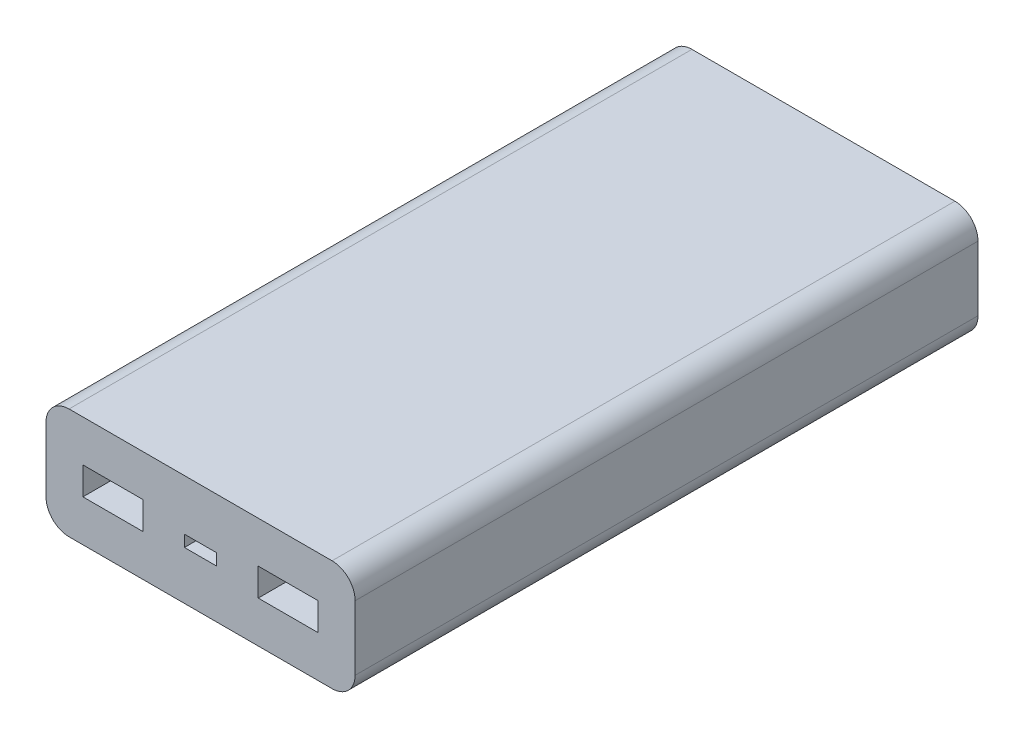
ISO-10303-21;
HEADER;
FILE_DESCRIPTION(('STEP AP214'),'2;1');
FILE_NAME('part.step','',(''),(''),'','','');
FILE_SCHEMA(('AUTOMOTIVE_DESIGN { 1 0 10303 214 1 1 1 1 }'));
ENDSEC;
DATA;
#1=APPLICATION_CONTEXT('core data for automotive mechanical design processes');
#2=APPLICATION_PROTOCOL_DEFINITION('international standard','automotive_design',2000,#1);
#3=PRODUCT_CONTEXT('',#1,'mechanical');
#4=PRODUCT('Part','Part','',(#3));
#5=PRODUCT_RELATED_PRODUCT_CATEGORY('part','',(#4));
#6=PRODUCT_DEFINITION_FORMATION('','',#4);
#7=PRODUCT_DEFINITION_CONTEXT('part definition',#1,'design');
#8=PRODUCT_DEFINITION('design','',#6,#7);
#9=PRODUCT_DEFINITION_SHAPE('','',#8);
#10=(LENGTH_UNIT() NAMED_UNIT(*) SI_UNIT(.MILLI.,.METRE.));
#11=(NAMED_UNIT(*) PLANE_ANGLE_UNIT() SI_UNIT($,.RADIAN.));
#12=(NAMED_UNIT(*) SI_UNIT($,.STERADIAN.) SOLID_ANGLE_UNIT());
#13=UNCERTAINTY_MEASURE_WITH_UNIT(LENGTH_MEASURE(1.E-05),#10,'distance_accuracy_value','');
#14=(GEOMETRIC_REPRESENTATION_CONTEXT(3) GLOBAL_UNCERTAINTY_ASSIGNED_CONTEXT((#13)) GLOBAL_UNIT_ASSIGNED_CONTEXT((#10,
#11,#12)) REPRESENTATION_CONTEXT('',''));
#15=CARTESIAN_POINT('',(0.,0.,0.));
#16=DIRECTION('',(0.,0.,1.));
#17=DIRECTION('',(1.,0.,0.));
#18=AXIS2_PLACEMENT_3D('',#15,#16,#17);
#19=CARTESIAN_POINT('',(0.,0.,135.));
#20=DIRECTION('',(1.,0.,0.));
#21=DIRECTION('',(0.,0.,-1.));
#22=AXIS2_PLACEMENT_3D('',#19,#20,#21);
#23=PLANE('',#22);
#24=DIRECTION('',(0.,-1.,0.));
#25=VECTOR('',#24,1.);
#26=CARTESIAN_POINT('',(0.,0.,0.));
#27=LINE('',#26,#25);
#28=CARTESIAN_POINT('',(0.,19.,0.));
#29=VERTEX_POINT('',#28);
#30=CARTESIAN_POINT('',(0.,5.,0.));
#31=VERTEX_POINT('',#30);
#32=EDGE_CURVE('E206',#29,#31,#27,.T.);
#33=ORIENTED_EDGE('',*,*,#32,.T.);
#34=DIRECTION('',(0.,0.,-1.));
#35=VECTOR('',#34,1.);
#36=CARTESIAN_POINT('',(0.,5.,135.));
#37=LINE('',#36,#35);
#38=CARTESIAN_POINT('',(0.,5.,135.));
#39=VERTEX_POINT('',#38);
#40=EDGE_CURVE('E310',#31,#39,#37,.F.);
#41=ORIENTED_EDGE('',*,*,#40,.T.);
#42=DIRECTION('',(0.,-1.,0.));
#43=VECTOR('',#42,1.);
#44=CARTESIAN_POINT('',(0.,0.,135.));
#45=LINE('',#44,#43);
#46=CARTESIAN_POINT('',(0.,19.,135.));
#47=VERTEX_POINT('',#46);
#48=EDGE_CURVE('E271',#47,#39,#45,.T.);
#49=ORIENTED_EDGE('',*,*,#48,.F.);
#50=DIRECTION('',(0.,0.,-1.));
#51=VECTOR('',#50,1.);
#52=CARTESIAN_POINT('',(0.,19.,135.));
#53=LINE('',#52,#51);
#54=EDGE_CURVE('E307',#47,#29,#53,.T.);
#55=ORIENTED_EDGE('',*,*,#54,.T.);
#56=EDGE_LOOP('',(#33,#41,#49,#55));
#57=FACE_BOUND('',#56,.T.);
#58=ADVANCED_FACE('F33',(#57),#23,.F.);
#59=CARTESIAN_POINT('',(0.,0.,135.));
#60=DIRECTION('',(0.,1.,0.));
#61=DIRECTION('',(0.,0.,1.));
#62=AXIS2_PLACEMENT_3D('',#59,#60,#61);
#63=PLANE('',#62);
#64=DIRECTION('',(1.,0.,0.));
#65=VECTOR('',#64,1.);
#66=CARTESIAN_POINT('',(0.,0.,135.));
#67=LINE('',#66,#65);
#68=CARTESIAN_POINT('',(5.,0.,135.));
#69=VERTEX_POINT('',#68);
#70=CARTESIAN_POINT('',(62.,0.,135.));
#71=VERTEX_POINT('',#70);
#72=EDGE_CURVE('E274',#69,#71,#67,.T.);
#73=ORIENTED_EDGE('',*,*,#72,.F.);
#74=DIRECTION('',(0.,0.,-1.));
#75=VECTOR('',#74,1.);
#76=CARTESIAN_POINT('',(5.,0.,135.));
#77=LINE('',#76,#75);
#78=CARTESIAN_POINT('',(5.,0.,0.));
#79=VERTEX_POINT('',#78);
#80=EDGE_CURVE('E296',#69,#79,#77,.T.);
#81=ORIENTED_EDGE('',*,*,#80,.T.);
#82=DIRECTION('',(1.,0.,0.));
#83=VECTOR('',#82,1.);
#84=CARTESIAN_POINT('',(0.,0.,0.));
#85=LINE('',#84,#83);
#86=CARTESIAN_POINT('',(62.,0.,0.));
#87=VERTEX_POINT('',#86);
#88=EDGE_CURVE('E287',#79,#87,#85,.T.);
#89=ORIENTED_EDGE('',*,*,#88,.T.);
#90=DIRECTION('',(0.,0.,-1.));
#91=VECTOR('',#90,1.);
#92=CARTESIAN_POINT('',(62.,0.,135.));
#93=LINE('',#92,#91);
#94=EDGE_CURVE('E284',#87,#71,#93,.F.);
#95=ORIENTED_EDGE('',*,*,#94,.T.);
#96=EDGE_LOOP('',(#73,#81,#89,#95));
#97=FACE_BOUND('',#96,.T.);
#98=ADVANCED_FACE('F349',(#97),#63,.F.);
#99=CARTESIAN_POINT('',(67.,0.,135.));
#100=DIRECTION('',(-1.,0.,0.));
#101=DIRECTION('',(0.,0.,1.));
#102=AXIS2_PLACEMENT_3D('',#99,#100,#101);
#103=PLANE('',#102);
#104=DIRECTION('',(0.,1.,0.));
#105=VECTOR('',#104,1.);
#106=CARTESIAN_POINT('',(67.,0.,135.));
#107=LINE('',#106,#105);
#108=CARTESIAN_POINT('',(67.,5.,135.));
#109=VERTEX_POINT('',#108);
#110=CARTESIAN_POINT('',(67.,19.,135.));
#111=VERTEX_POINT('',#110);
#112=EDGE_CURVE('E278',#109,#111,#107,.T.);
#113=ORIENTED_EDGE('',*,*,#112,.F.);
#114=DIRECTION('',(0.,0.,-1.));
#115=VECTOR('',#114,1.);
#116=CARTESIAN_POINT('',(67.,5.,135.));
#117=LINE('',#116,#115);
#118=CARTESIAN_POINT('',(67.,5.,0.));
#119=VERTEX_POINT('',#118);
#120=EDGE_CURVE('E322',#109,#119,#117,.T.);
#121=ORIENTED_EDGE('',*,*,#120,.T.);
#122=DIRECTION('',(0.,1.,0.));
#123=VECTOR('',#122,1.);
#124=CARTESIAN_POINT('',(67.,0.,0.));
#125=LINE('',#124,#123);
#126=CARTESIAN_POINT('',(67.,19.,0.));
#127=VERTEX_POINT('',#126);
#128=EDGE_CURVE('E290',#119,#127,#125,.T.);
#129=ORIENTED_EDGE('',*,*,#128,.T.);
#130=DIRECTION('',(0.,0.,-1.));
#131=VECTOR('',#130,1.);
#132=CARTESIAN_POINT('',(67.,19.,135.));
#133=LINE('',#132,#131);
#134=EDGE_CURVE('E320',#127,#111,#133,.F.);
#135=ORIENTED_EDGE('',*,*,#134,.T.);
#136=EDGE_LOOP('',(#113,#121,#129,#135));
#137=FACE_BOUND('',#136,.T.);
#138=ADVANCED_FACE('F358',(#137),#103,.F.);
#139=CARTESIAN_POINT('',(0.,24.,135.));
#140=DIRECTION('',(0.,-1.,0.));
#141=DIRECTION('',(0.,0.,-1.));
#142=AXIS2_PLACEMENT_3D('',#139,#140,#141);
#143=PLANE('',#142);
#144=DIRECTION('',(-1.,0.,0.));
#145=VECTOR('',#144,1.);
#146=CARTESIAN_POINT('',(0.,24.,135.));
#147=LINE('',#146,#145);
#148=CARTESIAN_POINT('',(62.,24.,135.));
#149=VERTEX_POINT('',#148);
#150=CARTESIAN_POINT('',(5.,24.,135.));
#151=VERTEX_POINT('',#150);
#152=EDGE_CURVE('E281',#149,#151,#147,.T.);
#153=ORIENTED_EDGE('',*,*,#152,.F.);
#154=DIRECTION('',(0.,0.,-1.));
#155=VECTOR('',#154,1.);
#156=CARTESIAN_POINT('',(62.,24.,135.));
#157=LINE('',#156,#155);
#158=CARTESIAN_POINT('',(62.,24.,0.));
#159=VERTEX_POINT('',#158);
#160=EDGE_CURVE('E11',#149,#159,#157,.T.);
#161=ORIENTED_EDGE('',*,*,#160,.T.);
#162=DIRECTION('',(-1.,0.,0.));
#163=VECTOR('',#162,1.);
#164=CARTESIAN_POINT('',(0.,24.,0.));
#165=LINE('',#164,#163);
#166=CARTESIAN_POINT('',(5.,24.,0.));
#167=VERTEX_POINT('',#166);
#168=EDGE_CURVE('E275',#159,#167,#165,.T.);
#169=ORIENTED_EDGE('',*,*,#168,.T.);
#170=DIRECTION('',(0.,0.,-1.));
#171=VECTOR('',#170,1.);
#172=CARTESIAN_POINT('',(5.,24.,135.));
#173=LINE('',#172,#171);
#174=EDGE_CURVE('E41',#167,#151,#173,.F.);
#175=ORIENTED_EDGE('',*,*,#174,.T.);
#176=EDGE_LOOP('',(#153,#161,#169,#175));
#177=FACE_BOUND('',#176,.T.);
#178=ADVANCED_FACE('F327',(#177),#143,.F.);
#179=CARTESIAN_POINT('',(0.,0.,135.));
#180=DIRECTION('',(0.,0.,-1.));
#181=DIRECTION('',(-1.,0.,0.));
#182=AXIS2_PLACEMENT_3D('',#179,#180,#181);
#183=PLANE('',#182);
#184=DIRECTION('',(1.,0.,0.));
#185=VECTOR('',#184,1.);
#186=CARTESIAN_POINT('',(8.,9.,135.));
#187=LINE('',#186,#185);
#188=CARTESIAN_POINT('',(8.,9.,135.));
#189=VERTEX_POINT('',#188);
#190=CARTESIAN_POINT('',(21.,9.,135.));
#191=VERTEX_POINT('',#190);
#192=EDGE_CURVE('E199',#189,#191,#187,.T.);
#193=ORIENTED_EDGE('',*,*,#192,.F.);
#194=DIRECTION('',(0.,-1.,0.));
#195=VECTOR('',#194,1.);
#196=CARTESIAN_POINT('',(8.,15.,135.));
#197=LINE('',#196,#195);
#198=CARTESIAN_POINT('',(8.,15.,135.));
#199=VERTEX_POINT('',#198);
#200=EDGE_CURVE('E48',#199,#189,#197,.T.);
#201=ORIENTED_EDGE('',*,*,#200,.F.);
#202=DIRECTION('',(-1.,0.,0.));
#203=VECTOR('',#202,1.);
#204=CARTESIAN_POINT('',(8.,15.,135.));
#205=LINE('',#204,#203);
#206=CARTESIAN_POINT('',(21.,15.,135.));
#207=VERTEX_POINT('',#206);
#208=EDGE_CURVE('E190',#207,#199,#205,.T.);
#209=ORIENTED_EDGE('',*,*,#208,.F.);
#210=DIRECTION('',(0.,1.,0.));
#211=VECTOR('',#210,1.);
#212=CARTESIAN_POINT('',(21.,15.,135.));
#213=LINE('',#212,#211);
#214=EDGE_CURVE('E193',#191,#207,#213,.T.);
#215=ORIENTED_EDGE('',*,*,#214,.F.);
#216=EDGE_LOOP('',(#193,#201,#209,#215));
#217=FACE_BOUND('',#216,.T.);
#218=DIRECTION('',(1.,0.,0.));
#219=VECTOR('',#218,1.);
#220=CARTESIAN_POINT('',(46.,9.,135.));
#221=LINE('',#220,#219);
#222=CARTESIAN_POINT('',(46.,9.,135.));
#223=VERTEX_POINT('',#222);
#224=CARTESIAN_POINT('',(59.,9.,135.));
#225=VERTEX_POINT('',#224);
#226=EDGE_CURVE('E225',#223,#225,#221,.T.);
#227=ORIENTED_EDGE('',*,*,#226,.F.);
#228=DIRECTION('',(0.,-1.,0.));
#229=VECTOR('',#228,1.);
#230=CARTESIAN_POINT('',(46.,15.,135.));
#231=LINE('',#230,#229);
#232=CARTESIAN_POINT('',(46.,15.,135.));
#233=VERTEX_POINT('',#232);
#234=EDGE_CURVE('E56',#233,#223,#231,.T.);
#235=ORIENTED_EDGE('',*,*,#234,.F.);
#236=DIRECTION('',(-1.,0.,0.));
#237=VECTOR('',#236,1.);
#238=CARTESIAN_POINT('',(46.,15.,135.));
#239=LINE('',#238,#237);
#240=CARTESIAN_POINT('',(59.,15.,135.));
#241=VERTEX_POINT('',#240);
#242=EDGE_CURVE('E214',#241,#233,#239,.T.);
#243=ORIENTED_EDGE('',*,*,#242,.F.);
#244=DIRECTION('',(0.,1.,0.));
#245=VECTOR('',#244,1.);
#246=CARTESIAN_POINT('',(59.,15.,135.));
#247=LINE('',#246,#245);
#248=EDGE_CURVE('E229',#225,#241,#247,.T.);
#249=ORIENTED_EDGE('',*,*,#248,.F.);
#250=EDGE_LOOP('',(#227,#235,#243,#249));
#251=FACE_BOUND('',#250,.T.);
#252=DIRECTION('',(1.,0.,0.));
#253=VECTOR('',#252,1.);
#254=CARTESIAN_POINT('',(30.,10.5,135.));
#255=LINE('',#254,#253);
#256=CARTESIAN_POINT('',(30.,10.5,135.));
#257=VERTEX_POINT('',#256);
#258=CARTESIAN_POINT('',(37.,10.5,135.));
#259=VERTEX_POINT('',#258);
#260=EDGE_CURVE('E256',#257,#259,#255,.T.);
#261=ORIENTED_EDGE('',*,*,#260,.F.);
#262=DIRECTION('',(0.,-1.,0.));
#263=VECTOR('',#262,1.);
#264=CARTESIAN_POINT('',(30.,13.,135.));
#265=LINE('',#264,#263);
#266=CARTESIAN_POINT('',(30.,13.,135.));
#267=VERTEX_POINT('',#266);
#268=EDGE_CURVE('E254',#267,#257,#265,.T.);
#269=ORIENTED_EDGE('',*,*,#268,.F.);
#270=DIRECTION('',(-1.,0.,0.));
#271=VECTOR('',#270,1.);
#272=CARTESIAN_POINT('',(30.,13.,135.));
#273=LINE('',#272,#271);
#274=CARTESIAN_POINT('',(37.,13.,135.));
#275=VERTEX_POINT('',#274);
#276=EDGE_CURVE('E244',#275,#267,#273,.T.);
#277=ORIENTED_EDGE('',*,*,#276,.F.);
#278=DIRECTION('',(0.,1.,0.));
#279=VECTOR('',#278,1.);
#280=CARTESIAN_POINT('',(37.,13.,135.));
#281=LINE('',#280,#279);
#282=EDGE_CURVE('E259',#259,#275,#281,.T.);
#283=ORIENTED_EDGE('',*,*,#282,.F.);
#284=EDGE_LOOP('',(#261,#269,#277,#283));
#285=FACE_BOUND('',#284,.T.);
#286=ORIENTED_EDGE('',*,*,#48,.T.);
#287=CARTESIAN_POINT('',(5.,5.,135.));
#288=DIRECTION('',(0.,0.,-1.));
#289=DIRECTION('',(-1.,0.,0.));
#290=AXIS2_PLACEMENT_3D('',#287,#288,#289);
#291=CIRCLE('',#290,5.);
#292=EDGE_CURVE('E318',#39,#69,#291,.F.);
#293=ORIENTED_EDGE('',*,*,#292,.T.);
#294=ORIENTED_EDGE('',*,*,#72,.T.);
#295=CARTESIAN_POINT('',(62.,5.,135.));
#296=DIRECTION('',(0.,0.,-1.));
#297=DIRECTION('',(-1.,0.,0.));
#298=AXIS2_PLACEMENT_3D('',#295,#296,#297);
#299=CIRCLE('',#298,5.);
#300=EDGE_CURVE('E316',#71,#109,#299,.F.);
#301=ORIENTED_EDGE('',*,*,#300,.T.);
#302=ORIENTED_EDGE('',*,*,#112,.T.);
#303=CARTESIAN_POINT('',(62.,19.,135.));
#304=DIRECTION('',(0.,0.,-1.));
#305=DIRECTION('',(-1.,0.,0.));
#306=AXIS2_PLACEMENT_3D('',#303,#304,#305);
#307=CIRCLE('',#306,5.);
#308=EDGE_CURVE('E314',#111,#149,#307,.F.);
#309=ORIENTED_EDGE('',*,*,#308,.T.);
#310=ORIENTED_EDGE('',*,*,#152,.T.);
#311=CARTESIAN_POINT('',(5.,19.,135.));
#312=DIRECTION('',(0.,0.,-1.));
#313=DIRECTION('',(-1.,0.,0.));
#314=AXIS2_PLACEMENT_3D('',#311,#312,#313);
#315=CIRCLE('',#314,5.);
#316=EDGE_CURVE('E312',#151,#47,#315,.F.);
#317=ORIENTED_EDGE('',*,*,#316,.T.);
#318=EDGE_LOOP('',(#286,#293,#294,#301,#302,#309,#310,#317));
#319=FACE_BOUND('',#318,.T.);
#320=ADVANCED_FACE('F333',(#217,#251,#285,#319),#183,.F.);
#321=CARTESIAN_POINT('',(0.,0.,0.));
#322=DIRECTION('',(0.,0.,-1.));
#323=DIRECTION('',(-1.,0.,0.));
#324=AXIS2_PLACEMENT_3D('',#321,#322,#323);
#325=PLANE('',#324);
#326=ORIENTED_EDGE('',*,*,#88,.F.);
#327=CARTESIAN_POINT('',(5.,5.,0.));
#328=DIRECTION('',(0.,0.,-1.));
#329=DIRECTION('',(-1.,0.,0.));
#330=AXIS2_PLACEMENT_3D('',#327,#328,#329);
#331=CIRCLE('',#330,5.);
#332=EDGE_CURVE('E305',#79,#31,#331,.T.);
#333=ORIENTED_EDGE('',*,*,#332,.T.);
#334=ORIENTED_EDGE('',*,*,#32,.F.);
#335=CARTESIAN_POINT('',(5.,19.,0.));
#336=DIRECTION('',(0.,0.,-1.));
#337=DIRECTION('',(-1.,0.,0.));
#338=AXIS2_PLACEMENT_3D('',#335,#336,#337);
#339=CIRCLE('',#338,5.);
#340=EDGE_CURVE('E299',#29,#167,#339,.T.);
#341=ORIENTED_EDGE('',*,*,#340,.T.);
#342=ORIENTED_EDGE('',*,*,#168,.F.);
#343=CARTESIAN_POINT('',(62.,19.,0.));
#344=DIRECTION('',(0.,0.,-1.));
#345=DIRECTION('',(-1.,0.,0.));
#346=AXIS2_PLACEMENT_3D('',#343,#344,#345);
#347=CIRCLE('',#346,5.);
#348=EDGE_CURVE('E301',#159,#127,#347,.T.);
#349=ORIENTED_EDGE('',*,*,#348,.T.);
#350=ORIENTED_EDGE('',*,*,#128,.F.);
#351=CARTESIAN_POINT('',(62.,5.,0.));
#352=DIRECTION('',(0.,0.,-1.));
#353=DIRECTION('',(-1.,0.,0.));
#354=AXIS2_PLACEMENT_3D('',#351,#352,#353);
#355=CIRCLE('',#354,5.);
#356=EDGE_CURVE('E303',#119,#87,#355,.T.);
#357=ORIENTED_EDGE('',*,*,#356,.T.);
#358=EDGE_LOOP('',(#326,#333,#334,#341,#342,#349,#350,#357));
#359=FACE_BOUND('',#358,.T.);
#360=ADVANCED_FACE('F342',(#359),#325,.T.);
#361=CARTESIAN_POINT('',(5.,5.,135.));
#362=DIRECTION('',(0.,0.,-1.));
#363=DIRECTION('',(-1.,0.,0.));
#364=AXIS2_PLACEMENT_3D('',#361,#362,#363);
#365=CYLINDRICAL_SURFACE('',#364,5.);
#366=ORIENTED_EDGE('',*,*,#292,.F.);
#367=ORIENTED_EDGE('',*,*,#40,.F.);
#368=ORIENTED_EDGE('',*,*,#332,.F.);
#369=ORIENTED_EDGE('',*,*,#80,.F.);
#370=EDGE_LOOP('',(#366,#367,#368,#369));
#371=FACE_BOUND('',#370,.T.);
#372=ADVANCED_FACE('F346',(#371),#365,.T.);
#373=CARTESIAN_POINT('',(62.,5.,135.));
#374=DIRECTION('',(0.,0.,-1.));
#375=DIRECTION('',(-1.,0.,0.));
#376=AXIS2_PLACEMENT_3D('',#373,#374,#375);
#377=CYLINDRICAL_SURFACE('',#376,5.);
#378=ORIENTED_EDGE('',*,*,#300,.F.);
#379=ORIENTED_EDGE('',*,*,#94,.F.);
#380=ORIENTED_EDGE('',*,*,#356,.F.);
#381=ORIENTED_EDGE('',*,*,#120,.F.);
#382=EDGE_LOOP('',(#378,#379,#380,#381));
#383=FACE_BOUND('',#382,.T.);
#384=ADVANCED_FACE('F355',(#383),#377,.T.);
#385=CARTESIAN_POINT('',(62.,19.,135.));
#386=DIRECTION('',(0.,0.,-1.));
#387=DIRECTION('',(-1.,0.,0.));
#388=AXIS2_PLACEMENT_3D('',#385,#386,#387);
#389=CYLINDRICAL_SURFACE('',#388,5.);
#390=ORIENTED_EDGE('',*,*,#308,.F.);
#391=ORIENTED_EDGE('',*,*,#134,.F.);
#392=ORIENTED_EDGE('',*,*,#348,.F.);
#393=ORIENTED_EDGE('',*,*,#160,.F.);
#394=EDGE_LOOP('',(#390,#391,#392,#393));
#395=FACE_BOUND('',#394,.T.);
#396=ADVANCED_FACE('F361',(#395),#389,.T.);
#397=CARTESIAN_POINT('',(5.,19.,135.));
#398=DIRECTION('',(0.,0.,-1.));
#399=DIRECTION('',(-1.,0.,0.));
#400=AXIS2_PLACEMENT_3D('',#397,#398,#399);
#401=CYLINDRICAL_SURFACE('',#400,5.);
#402=ORIENTED_EDGE('',*,*,#316,.F.);
#403=ORIENTED_EDGE('',*,*,#174,.F.);
#404=ORIENTED_EDGE('',*,*,#340,.F.);
#405=ORIENTED_EDGE('',*,*,#54,.F.);
#406=EDGE_LOOP('',(#402,#403,#404,#405));
#407=FACE_BOUND('',#406,.T.);
#408=ADVANCED_FACE('F35',(#407),#401,.T.);
#409=CARTESIAN_POINT('',(30.,13.,115.));
#410=DIRECTION('',(-1.,0.,0.));
#411=DIRECTION('',(0.,0.,1.));
#412=AXIS2_PLACEMENT_3D('',#409,#410,#411);
#413=PLANE('',#412);
#414=ORIENTED_EDGE('',*,*,#268,.T.);
#415=DIRECTION('',(0.,0.,1.));
#416=VECTOR('',#415,1.);
#417=CARTESIAN_POINT('',(30.,10.5,115.));
#418=LINE('',#417,#416);
#419=CARTESIAN_POINT('',(30.,10.5,115.));
#420=VERTEX_POINT('',#419);
#421=EDGE_CURVE('E253',#420,#257,#418,.T.);
#422=ORIENTED_EDGE('',*,*,#421,.F.);
#423=DIRECTION('',(0.,-1.,0.));
#424=VECTOR('',#423,1.);
#425=CARTESIAN_POINT('',(30.,13.,115.));
#426=LINE('',#425,#424);
#427=CARTESIAN_POINT('',(30.,13.,115.));
#428=VERTEX_POINT('',#427);
#429=EDGE_CURVE('E240',#428,#420,#426,.T.);
#430=ORIENTED_EDGE('',*,*,#429,.F.);
#431=DIRECTION('',(0.,0.,1.));
#432=VECTOR('',#431,1.);
#433=CARTESIAN_POINT('',(30.,13.,115.));
#434=LINE('',#433,#432);
#435=EDGE_CURVE('E226',#428,#267,#434,.T.);
#436=ORIENTED_EDGE('',*,*,#435,.T.);
#437=EDGE_LOOP('',(#414,#422,#430,#436));
#438=FACE_BOUND('',#437,.T.);
#439=ADVANCED_FACE('F367',(#438),#413,.F.);
#440=CARTESIAN_POINT('',(30.,13.,115.));
#441=DIRECTION('',(0.,1.,0.));
#442=DIRECTION('',(0.,0.,1.));
#443=AXIS2_PLACEMENT_3D('',#440,#441,#442);
#444=PLANE('',#443);
#445=ORIENTED_EDGE('',*,*,#276,.T.);
#446=ORIENTED_EDGE('',*,*,#435,.F.);
#447=DIRECTION('',(-1.,0.,0.));
#448=VECTOR('',#447,1.);
#449=CARTESIAN_POINT('',(30.,13.,115.));
#450=LINE('',#449,#448);
#451=CARTESIAN_POINT('',(37.,13.,115.));
#452=VERTEX_POINT('',#451);
#453=EDGE_CURVE('E250',#452,#428,#450,.T.);
#454=ORIENTED_EDGE('',*,*,#453,.F.);
#455=DIRECTION('',(0.,0.,1.));
#456=VECTOR('',#455,1.);
#457=CARTESIAN_POINT('',(37.,13.,115.));
#458=LINE('',#457,#456);
#459=EDGE_CURVE('E265',#452,#275,#458,.T.);
#460=ORIENTED_EDGE('',*,*,#459,.T.);
#461=EDGE_LOOP('',(#445,#446,#454,#460));
#462=FACE_BOUND('',#461,.T.);
#463=ADVANCED_FACE('F416',(#462),#444,.F.);
#464=CARTESIAN_POINT('',(37.,13.,115.));
#465=DIRECTION('',(1.,0.,0.));
#466=DIRECTION('',(0.,0.,-1.));
#467=AXIS2_PLACEMENT_3D('',#464,#465,#466);
#468=PLANE('',#467);
#469=ORIENTED_EDGE('',*,*,#282,.T.);
#470=ORIENTED_EDGE('',*,*,#459,.F.);
#471=DIRECTION('',(0.,1.,0.));
#472=VECTOR('',#471,1.);
#473=CARTESIAN_POINT('',(37.,13.,115.));
#474=LINE('',#473,#472);
#475=CARTESIAN_POINT('',(37.,10.5,115.));
#476=VERTEX_POINT('',#475);
#477=EDGE_CURVE('E247',#476,#452,#474,.T.);
#478=ORIENTED_EDGE('',*,*,#477,.F.);
#479=DIRECTION('',(0.,0.,1.));
#480=VECTOR('',#479,1.);
#481=CARTESIAN_POINT('',(37.,10.5,115.));
#482=LINE('',#481,#480);
#483=EDGE_CURVE('E267',#476,#259,#482,.T.);
#484=ORIENTED_EDGE('',*,*,#483,.T.);
#485=EDGE_LOOP('',(#469,#470,#478,#484));
#486=FACE_BOUND('',#485,.T.);
#487=ADVANCED_FACE('F425',(#486),#468,.F.);
#488=CARTESIAN_POINT('',(30.,10.5,115.));
#489=DIRECTION('',(0.,-1.,0.));
#490=DIRECTION('',(0.,0.,-1.));
#491=AXIS2_PLACEMENT_3D('',#488,#489,#490);
#492=PLANE('',#491);
#493=ORIENTED_EDGE('',*,*,#260,.T.);
#494=ORIENTED_EDGE('',*,*,#483,.F.);
#495=DIRECTION('',(1.,0.,0.));
#496=VECTOR('',#495,1.);
#497=CARTESIAN_POINT('',(30.,10.5,115.));
#498=LINE('',#497,#496);
#499=EDGE_CURVE('E243',#420,#476,#498,.T.);
#500=ORIENTED_EDGE('',*,*,#499,.F.);
#501=ORIENTED_EDGE('',*,*,#421,.T.);
#502=EDGE_LOOP('',(#493,#494,#500,#501));
#503=FACE_BOUND('',#502,.T.);
#504=ADVANCED_FACE('F435',(#503),#492,.F.);
#505=CARTESIAN_POINT('',(0.,0.,115.));
#506=DIRECTION('',(0.,0.,1.));
#507=DIRECTION('',(1.,0.,0.));
#508=AXIS2_PLACEMENT_3D('',#505,#506,#507);
#509=PLANE('',#508);
#510=ORIENTED_EDGE('',*,*,#429,.T.);
#511=ORIENTED_EDGE('',*,*,#499,.T.);
#512=ORIENTED_EDGE('',*,*,#477,.T.);
#513=ORIENTED_EDGE('',*,*,#453,.T.);
#514=EDGE_LOOP('',(#510,#511,#512,#513));
#515=FACE_BOUND('',#514,.T.);
#516=ADVANCED_FACE('F445',(#515),#509,.T.);
#517=CARTESIAN_POINT('',(46.,15.,115.));
#518=DIRECTION('',(-1.,0.,0.));
#519=DIRECTION('',(0.,0.,1.));
#520=AXIS2_PLACEMENT_3D('',#517,#518,#519);
#521=PLANE('',#520);
#522=ORIENTED_EDGE('',*,*,#234,.T.);
#523=DIRECTION('',(0.,0.,1.));
#524=VECTOR('',#523,1.);
#525=CARTESIAN_POINT('',(46.,9.,115.));
#526=LINE('',#525,#524);
#527=CARTESIAN_POINT('',(46.,9.,115.));
#528=VERTEX_POINT('',#527);
#529=EDGE_CURVE('E223',#528,#223,#526,.T.);
#530=ORIENTED_EDGE('',*,*,#529,.F.);
#531=DIRECTION('',(0.,-1.,0.));
#532=VECTOR('',#531,1.);
#533=CARTESIAN_POINT('',(46.,15.,115.));
#534=LINE('',#533,#532);
#535=CARTESIAN_POINT('',(46.,15.,115.));
#536=VERTEX_POINT('',#535);
#537=EDGE_CURVE('E210',#536,#528,#534,.T.);
#538=ORIENTED_EDGE('',*,*,#537,.F.);
#539=DIRECTION('',(0.,0.,1.));
#540=VECTOR('',#539,1.);
#541=CARTESIAN_POINT('',(46.,15.,115.));
#542=LINE('',#541,#540);
#543=EDGE_CURVE('E200',#536,#233,#542,.T.);
#544=ORIENTED_EDGE('',*,*,#543,.T.);
#545=EDGE_LOOP('',(#522,#530,#538,#544));
#546=FACE_BOUND('',#545,.T.);
#547=ADVANCED_FACE('F455',(#546),#521,.F.);
#548=CARTESIAN_POINT('',(46.,15.,115.));
#549=DIRECTION('',(0.,1.,0.));
#550=DIRECTION('',(0.,0.,1.));
#551=AXIS2_PLACEMENT_3D('',#548,#549,#550);
#552=PLANE('',#551);
#553=ORIENTED_EDGE('',*,*,#242,.T.);
#554=ORIENTED_EDGE('',*,*,#543,.F.);
#555=DIRECTION('',(-1.,0.,0.));
#556=VECTOR('',#555,1.);
#557=CARTESIAN_POINT('',(46.,15.,115.));
#558=LINE('',#557,#556);
#559=CARTESIAN_POINT('',(59.,15.,115.));
#560=VERTEX_POINT('',#559);
#561=EDGE_CURVE('E220',#560,#536,#558,.T.);
#562=ORIENTED_EDGE('',*,*,#561,.F.);
#563=DIRECTION('',(0.,0.,1.));
#564=VECTOR('',#563,1.);
#565=CARTESIAN_POINT('',(59.,15.,115.));
#566=LINE('',#565,#564);
#567=EDGE_CURVE('E235',#560,#241,#566,.T.);
#568=ORIENTED_EDGE('',*,*,#567,.T.);
#569=EDGE_LOOP('',(#553,#554,#562,#568));
#570=FACE_BOUND('',#569,.T.);
#571=ADVANCED_FACE('F465',(#570),#552,.F.);
#572=CARTESIAN_POINT('',(59.,15.,115.));
#573=DIRECTION('',(1.,0.,0.));
#574=DIRECTION('',(0.,0.,-1.));
#575=AXIS2_PLACEMENT_3D('',#572,#573,#574);
#576=PLANE('',#575);
#577=ORIENTED_EDGE('',*,*,#248,.T.);
#578=ORIENTED_EDGE('',*,*,#567,.F.);
#579=DIRECTION('',(0.,1.,0.));
#580=VECTOR('',#579,1.);
#581=CARTESIAN_POINT('',(59.,15.,115.));
#582=LINE('',#581,#580);
#583=CARTESIAN_POINT('',(59.,9.,115.));
#584=VERTEX_POINT('',#583);
#585=EDGE_CURVE('E217',#584,#560,#582,.T.);
#586=ORIENTED_EDGE('',*,*,#585,.F.);
#587=DIRECTION('',(0.,0.,1.));
#588=VECTOR('',#587,1.);
#589=CARTESIAN_POINT('',(59.,9.,115.));
#590=LINE('',#589,#588);
#591=EDGE_CURVE('E237',#584,#225,#590,.T.);
#592=ORIENTED_EDGE('',*,*,#591,.T.);
#593=EDGE_LOOP('',(#577,#578,#586,#592));
#594=FACE_BOUND('',#593,.T.);
#595=ADVANCED_FACE('F474',(#594),#576,.F.);
#596=CARTESIAN_POINT('',(46.,9.,115.));
#597=DIRECTION('',(0.,-1.,0.));
#598=DIRECTION('',(0.,0.,-1.));
#599=AXIS2_PLACEMENT_3D('',#596,#597,#598);
#600=PLANE('',#599);
#601=ORIENTED_EDGE('',*,*,#226,.T.);
#602=ORIENTED_EDGE('',*,*,#591,.F.);
#603=DIRECTION('',(1.,0.,0.));
#604=VECTOR('',#603,1.);
#605=CARTESIAN_POINT('',(46.,9.,115.));
#606=LINE('',#605,#604);
#607=EDGE_CURVE('E213',#528,#584,#606,.T.);
#608=ORIENTED_EDGE('',*,*,#607,.F.);
#609=ORIENTED_EDGE('',*,*,#529,.T.);
#610=EDGE_LOOP('',(#601,#602,#608,#609));
#611=FACE_BOUND('',#610,.T.);
#612=ADVANCED_FACE('F484',(#611),#600,.F.);
#613=CARTESIAN_POINT('',(0.,0.,115.));
#614=DIRECTION('',(0.,0.,1.));
#615=DIRECTION('',(1.,0.,0.));
#616=AXIS2_PLACEMENT_3D('',#613,#614,#615);
#617=PLANE('',#616);
#618=ORIENTED_EDGE('',*,*,#537,.T.);
#619=ORIENTED_EDGE('',*,*,#607,.T.);
#620=ORIENTED_EDGE('',*,*,#585,.T.);
#621=ORIENTED_EDGE('',*,*,#561,.T.);
#622=EDGE_LOOP('',(#618,#619,#620,#621));
#623=FACE_BOUND('',#622,.T.);
#624=ADVANCED_FACE('F494',(#623),#617,.T.);
#625=CARTESIAN_POINT('',(8.,15.,115.));
#626=DIRECTION('',(-1.,0.,0.));
#627=DIRECTION('',(0.,0.,1.));
#628=AXIS2_PLACEMENT_3D('',#625,#626,#627);
#629=PLANE('',#628);
#630=ORIENTED_EDGE('',*,*,#200,.T.);
#631=DIRECTION('',(0.,0.,1.));
#632=VECTOR('',#631,1.);
#633=CARTESIAN_POINT('',(8.,9.,115.));
#634=LINE('',#633,#632);
#635=CARTESIAN_POINT('',(8.,9.,115.));
#636=VERTEX_POINT('',#635);
#637=EDGE_CURVE('E168',#636,#189,#634,.T.);
#638=ORIENTED_EDGE('',*,*,#637,.F.);
#639=DIRECTION('',(0.,-1.,0.));
#640=VECTOR('',#639,1.);
#641=CARTESIAN_POINT('',(8.,15.,115.));
#642=LINE('',#641,#640);
#643=CARTESIAN_POINT('',(8.,15.,115.));
#644=VERTEX_POINT('',#643);
#645=EDGE_CURVE('E172',#644,#636,#642,.T.);
#646=ORIENTED_EDGE('',*,*,#645,.F.);
#647=DIRECTION('',(0.,0.,1.));
#648=VECTOR('',#647,1.);
#649=CARTESIAN_POINT('',(8.,15.,115.));
#650=LINE('',#649,#648);
#651=EDGE_CURVE('E204',#644,#199,#650,.T.);
#652=ORIENTED_EDGE('',*,*,#651,.T.);
#653=EDGE_LOOP('',(#630,#638,#646,#652));
#654=FACE_BOUND('',#653,.T.);
#655=ADVANCED_FACE('F170',(#654),#629,.F.);
#656=CARTESIAN_POINT('',(8.,15.,115.));
#657=DIRECTION('',(0.,1.,0.));
#658=DIRECTION('',(0.,0.,1.));
#659=AXIS2_PLACEMENT_3D('',#656,#657,#658);
#660=PLANE('',#659);
#661=ORIENTED_EDGE('',*,*,#208,.T.);
#662=ORIENTED_EDGE('',*,*,#651,.F.);
#663=DIRECTION('',(-1.,0.,0.));
#664=VECTOR('',#663,1.);
#665=CARTESIAN_POINT('',(8.,15.,115.));
#666=LINE('',#665,#664);
#667=CARTESIAN_POINT('',(21.,15.,115.));
#668=VERTEX_POINT('',#667);
#669=EDGE_CURVE('E178',#668,#644,#666,.T.);
#670=ORIENTED_EDGE('',*,*,#669,.F.);
#671=DIRECTION('',(0.,0.,1.));
#672=VECTOR('',#671,1.);
#673=CARTESIAN_POINT('',(21.,15.,115.));
#674=LINE('',#673,#672);
#675=EDGE_CURVE('E207',#668,#207,#674,.T.);
#676=ORIENTED_EDGE('',*,*,#675,.T.);
#677=EDGE_LOOP('',(#661,#662,#670,#676));
#678=FACE_BOUND('',#677,.T.);
#679=ADVANCED_FACE('F513',(#678),#660,.F.);
#680=CARTESIAN_POINT('',(21.,15.,115.));
#681=DIRECTION('',(1.,0.,0.));
#682=DIRECTION('',(0.,0.,-1.));
#683=AXIS2_PLACEMENT_3D('',#680,#681,#682);
#684=PLANE('',#683);
#685=ORIENTED_EDGE('',*,*,#214,.T.);
#686=ORIENTED_EDGE('',*,*,#675,.F.);
#687=DIRECTION('',(0.,1.,0.));
#688=VECTOR('',#687,1.);
#689=CARTESIAN_POINT('',(21.,15.,115.));
#690=LINE('',#689,#688);
#691=CARTESIAN_POINT('',(21.,9.,115.));
#692=VERTEX_POINT('',#691);
#693=EDGE_CURVE('E186',#692,#668,#690,.T.);
#694=ORIENTED_EDGE('',*,*,#693,.F.);
#695=DIRECTION('',(0.,0.,1.));
#696=VECTOR('',#695,1.);
#697=CARTESIAN_POINT('',(21.,9.,115.));
#698=LINE('',#697,#696);
#699=EDGE_CURVE('E177',#692,#191,#698,.T.);
#700=ORIENTED_EDGE('',*,*,#699,.T.);
#701=EDGE_LOOP('',(#685,#686,#694,#700));
#702=FACE_BOUND('',#701,.T.);
#703=ADVANCED_FACE('F522',(#702),#684,.F.);
#704=CARTESIAN_POINT('',(8.,9.,115.));
#705=DIRECTION('',(0.,-1.,0.));
#706=DIRECTION('',(0.,0.,-1.));
#707=AXIS2_PLACEMENT_3D('',#704,#705,#706);
#708=PLANE('',#707);
#709=ORIENTED_EDGE('',*,*,#192,.T.);
#710=ORIENTED_EDGE('',*,*,#699,.F.);
#711=DIRECTION('',(1.,0.,0.));
#712=VECTOR('',#711,1.);
#713=CARTESIAN_POINT('',(8.,9.,115.));
#714=LINE('',#713,#712);
#715=EDGE_CURVE('E181',#636,#692,#714,.T.);
#716=ORIENTED_EDGE('',*,*,#715,.F.);
#717=ORIENTED_EDGE('',*,*,#637,.T.);
#718=EDGE_LOOP('',(#709,#710,#716,#717));
#719=FACE_BOUND('',#718,.T.);
#720=ADVANCED_FACE('F182',(#719),#708,.F.);
#721=CARTESIAN_POINT('',(0.,0.,115.));
#722=DIRECTION('',(0.,0.,1.));
#723=DIRECTION('',(1.,0.,0.));
#724=AXIS2_PLACEMENT_3D('',#721,#722,#723);
#725=PLANE('',#724);
#726=ORIENTED_EDGE('',*,*,#645,.T.);
#727=ORIENTED_EDGE('',*,*,#715,.T.);
#728=ORIENTED_EDGE('',*,*,#693,.T.);
#729=ORIENTED_EDGE('',*,*,#669,.T.);
#730=EDGE_LOOP('',(#726,#727,#728,#729));
#731=FACE_BOUND('',#730,.T.);
#732=ADVANCED_FACE('F188',(#731),#725,.T.);
#733=CLOSED_SHELL('',(#58,#98,#138,#178,#320,#360,#372,#384,#396,#408,#439,#463,#487,#504,#516,
#547,#571,#595,#612,#624,#655,#679,#703,#720,#732));
#734=MANIFOLD_SOLID_BREP('B2',#733);
#735=ADVANCED_BREP_SHAPE_REPRESENTATION('',(#18,#734),#14);
#736=SHAPE_DEFINITION_REPRESENTATION(#9,#735);
ENDSEC;
END-ISO-10303-21;
